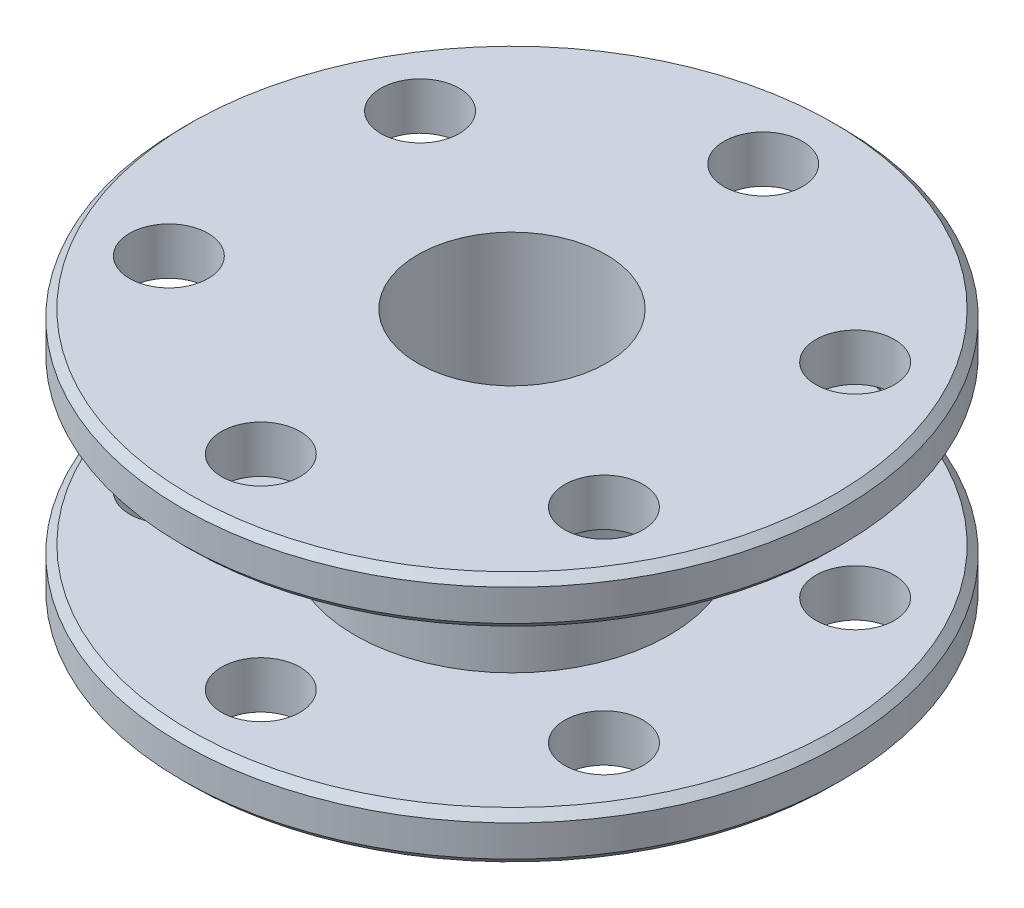
ISO-10303-21;
HEADER;
FILE_DESCRIPTION(('STEP AP214'),'2;1');
FILE_NAME('part.step','',(''),(''),'','','');
FILE_SCHEMA(('AUTOMOTIVE_DESIGN { 1 0 10303 214 1 1 1 1 }'));
ENDSEC;
DATA;
#1=APPLICATION_CONTEXT('core data for automotive mechanical design processes');
#2=APPLICATION_PROTOCOL_DEFINITION('international standard','automotive_design',2000,#1);
#3=PRODUCT_CONTEXT('',#1,'mechanical');
#4=PRODUCT('Part','Part','',(#3));
#5=PRODUCT_RELATED_PRODUCT_CATEGORY('part','',(#4));
#6=PRODUCT_DEFINITION_FORMATION('','',#4);
#7=PRODUCT_DEFINITION_CONTEXT('part definition',#1,'design');
#8=PRODUCT_DEFINITION('design','',#6,#7);
#9=PRODUCT_DEFINITION_SHAPE('','',#8);
#10=(LENGTH_UNIT() NAMED_UNIT(*) SI_UNIT(.MILLI.,.METRE.));
#11=(NAMED_UNIT(*) PLANE_ANGLE_UNIT() SI_UNIT($,.RADIAN.));
#12=(NAMED_UNIT(*) SI_UNIT($,.STERADIAN.) SOLID_ANGLE_UNIT());
#13=UNCERTAINTY_MEASURE_WITH_UNIT(LENGTH_MEASURE(1.E-05),#10,'distance_accuracy_value','');
#14=(GEOMETRIC_REPRESENTATION_CONTEXT(3) GLOBAL_UNCERTAINTY_ASSIGNED_CONTEXT((#13)) GLOBAL_UNIT_ASSIGNED_CONTEXT((#10,
#11,#12)) REPRESENTATION_CONTEXT('',''));
#15=CARTESIAN_POINT('',(0.,0.,0.));
#16=DIRECTION('',(0.,0.,1.));
#17=DIRECTION('',(1.,0.,0.));
#18=AXIS2_PLACEMENT_3D('',#15,#16,#17);
#19=CARTESIAN_POINT('',(0.,16.,0.));
#20=DIRECTION('',(0.,-1.,0.));
#21=DIRECTION('',(0.,0.,-1.));
#22=AXIS2_PLACEMENT_3D('',#19,#20,#21);
#23=CYLINDRICAL_SURFACE('',#22,21.);
#24=CARTESIAN_POINT('',(0.,0.499999999999994,0.));
#25=DIRECTION('',(0.,1.,0.));
#26=DIRECTION('',(0.,0.,1.));
#27=AXIS2_PLACEMENT_3D('',#24,#25,#26);
#28=CIRCLE('',#27,21.);
#29=CARTESIAN_POINT('',(0.,0.499999999999994,21.));
#30=VERTEX_POINT('',#29);
#31=EDGE_CURVE('E63',#30,#30,#28,.T.);
#32=ORIENTED_EDGE('',*,*,#31,.T.);
#33=EDGE_LOOP('',(#32));
#34=FACE_BOUND('',#33,.T.);
#35=CARTESIAN_POINT('',(0.,2.49999999999999,0.));
#36=DIRECTION('',(0.,-1.,0.));
#37=DIRECTION('',(0.,0.,-1.));
#38=AXIS2_PLACEMENT_3D('',#35,#36,#37);
#39=CIRCLE('',#38,21.);
#40=CARTESIAN_POINT('',(0.,2.49999999999999,-21.));
#41=VERTEX_POINT('',#40);
#42=EDGE_CURVE('E66',#41,#41,#39,.T.);
#43=ORIENTED_EDGE('',*,*,#42,.T.);
#44=EDGE_LOOP('',(#43));
#45=FACE_BOUND('',#44,.T.);
#46=ADVANCED_FACE('F36',(#34,#45),#23,.T.);
#47=CARTESIAN_POINT('',(0.,16.,-16.));
#48=DIRECTION('',(0.,-1.,0.));
#49=DIRECTION('',(0.,0.,-1.));
#50=AXIS2_PLACEMENT_3D('',#47,#48,#49);
#51=CYLINDRICAL_SURFACE('',#50,2.5);
#52=CARTESIAN_POINT('',(0.,3.,-16.));
#53=DIRECTION('',(0.,-1.,0.));
#54=DIRECTION('',(0.,0.,-1.));
#55=AXIS2_PLACEMENT_3D('',#52,#53,#54);
#56=CIRCLE('',#55,2.5);
#57=CARTESIAN_POINT('',(0.,3.,-18.5));
#58=VERTEX_POINT('',#57);
#59=EDGE_CURVE('E119',#58,#58,#56,.T.);
#60=ORIENTED_EDGE('',*,*,#59,.F.);
#61=EDGE_LOOP('',(#60));
#62=FACE_BOUND('',#61,.T.);
#63=CARTESIAN_POINT('',(0.,0.,-16.));
#64=DIRECTION('',(0.,1.,0.));
#65=DIRECTION('',(0.,0.,1.));
#66=AXIS2_PLACEMENT_3D('',#63,#64,#65);
#67=CIRCLE('',#66,2.5);
#68=CARTESIAN_POINT('',(0.,0.,-13.5));
#69=VERTEX_POINT('',#68);
#70=EDGE_CURVE('E86',#69,#69,#67,.T.);
#71=ORIENTED_EDGE('',*,*,#70,.F.);
#72=EDGE_LOOP('',(#71));
#73=FACE_BOUND('',#72,.T.);
#74=ADVANCED_FACE('F179',(#62,#73),#51,.F.);
#75=CARTESIAN_POINT('',(13.8564064605512,16.,-8.0000000000004));
#76=DIRECTION('',(0.,-1.,0.));
#77=DIRECTION('',(0.,0.,-1.));
#78=AXIS2_PLACEMENT_3D('',#75,#76,#77);
#79=CYLINDRICAL_SURFACE('',#78,2.50000000000014);
#80=CARTESIAN_POINT('',(13.8564064605512,3.,-8.0000000000004));
#81=DIRECTION('',(0.,-1.,0.));
#82=DIRECTION('',(0.,0.,-1.));
#83=AXIS2_PLACEMENT_3D('',#80,#81,#82);
#84=CIRCLE('',#83,2.50000000000014);
#85=CARTESIAN_POINT('',(13.8564064605512,3.,-10.5000000000005));
#86=VERTEX_POINT('',#85);
#87=EDGE_CURVE('E124',#86,#86,#84,.T.);
#88=ORIENTED_EDGE('',*,*,#87,.F.);
#89=EDGE_LOOP('',(#88));
#90=FACE_BOUND('',#89,.T.);
#91=CARTESIAN_POINT('',(13.8564064605512,0.,-8.0000000000004));
#92=DIRECTION('',(0.,1.,0.));
#93=DIRECTION('',(0.,0.,1.));
#94=AXIS2_PLACEMENT_3D('',#91,#92,#93);
#95=CIRCLE('',#94,2.50000000000014);
#96=CARTESIAN_POINT('',(13.8564064605512,0.,-5.50000000000025));
#97=VERTEX_POINT('',#96);
#98=EDGE_CURVE('E92',#97,#97,#95,.T.);
#99=ORIENTED_EDGE('',*,*,#98,.F.);
#100=EDGE_LOOP('',(#99));
#101=FACE_BOUND('',#100,.T.);
#102=ADVANCED_FACE('F221',(#90,#101),#79,.F.);
#103=CARTESIAN_POINT('',(13.8564064605517,16.,7.99999999999961));
#104=DIRECTION('',(0.,-1.,0.));
#105=DIRECTION('',(0.,0.,-1.));
#106=AXIS2_PLACEMENT_3D('',#103,#104,#105);
#107=CYLINDRICAL_SURFACE('',#106,2.50000000000061);
#108=CARTESIAN_POINT('',(13.8564064605517,3.,7.99999999999961));
#109=DIRECTION('',(0.,-1.,0.));
#110=DIRECTION('',(0.,0.,-1.));
#111=AXIS2_PLACEMENT_3D('',#108,#109,#110);
#112=CIRCLE('',#111,2.50000000000061);
#113=CARTESIAN_POINT('',(13.8564064605517,3.,5.499999999999));
#114=VERTEX_POINT('',#113);
#115=EDGE_CURVE('E127',#114,#114,#112,.T.);
#116=ORIENTED_EDGE('',*,*,#115,.F.);
#117=EDGE_LOOP('',(#116));
#118=FACE_BOUND('',#117,.T.);
#119=CARTESIAN_POINT('',(13.8564064605517,0.,7.99999999999961));
#120=DIRECTION('',(0.,1.,0.));
#121=DIRECTION('',(0.,0.,1.));
#122=AXIS2_PLACEMENT_3D('',#119,#120,#121);
#123=CIRCLE('',#122,2.50000000000061);
#124=CARTESIAN_POINT('',(13.8564064605517,0.,10.5000000000002));
#125=VERTEX_POINT('',#124);
#126=EDGE_CURVE('E98',#125,#125,#123,.T.);
#127=ORIENTED_EDGE('',*,*,#126,.F.);
#128=EDGE_LOOP('',(#127));
#129=FACE_BOUND('',#128,.T.);
#130=ADVANCED_FACE('F294',(#118,#129),#107,.F.);
#131=CARTESIAN_POINT('',(9.03616397137021E-13,16.,16.));
#132=DIRECTION('',(0.,-1.,0.));
#133=DIRECTION('',(0.,0.,-1.));
#134=AXIS2_PLACEMENT_3D('',#131,#132,#133);
#135=CYLINDRICAL_SURFACE('',#134,2.50000000000097);
#136=CARTESIAN_POINT('',(9.03616397137021E-13,3.,16.));
#137=DIRECTION('',(0.,-1.,0.));
#138=DIRECTION('',(0.,0.,-1.));
#139=AXIS2_PLACEMENT_3D('',#136,#137,#138);
#140=CIRCLE('',#139,2.50000000000097);
#141=CARTESIAN_POINT('',(9.03616397137021E-13,3.,13.499999999999));
#142=VERTEX_POINT('',#141);
#143=EDGE_CURVE('E130',#142,#142,#140,.T.);
#144=ORIENTED_EDGE('',*,*,#143,.F.);
#145=EDGE_LOOP('',(#144));
#146=FACE_BOUND('',#145,.T.);
#147=CARTESIAN_POINT('',(9.03616397137021E-13,0.,16.));
#148=DIRECTION('',(0.,1.,0.));
#149=DIRECTION('',(0.,0.,1.));
#150=AXIS2_PLACEMENT_3D('',#147,#148,#149);
#151=CIRCLE('',#150,2.50000000000097);
#152=CARTESIAN_POINT('',(9.03616397137021E-13,0.,18.500000000001));
#153=VERTEX_POINT('',#152);
#154=EDGE_CURVE('E104',#153,#153,#151,.T.);
#155=ORIENTED_EDGE('',*,*,#154,.F.);
#156=EDGE_LOOP('',(#155));
#157=FACE_BOUND('',#156,.T.);
#158=ADVANCED_FACE('F289',(#146,#157),#135,.F.);
#159=CARTESIAN_POINT('',(-13.8564064605503,16.,8.0000000000004));
#160=DIRECTION('',(0.,-1.,0.));
#161=DIRECTION('',(0.,0.,-1.));
#162=AXIS2_PLACEMENT_3D('',#159,#160,#161);
#163=CYLINDRICAL_SURFACE('',#162,2.50000000000091);
#164=CARTESIAN_POINT('',(-13.8564064605503,3.,8.0000000000004));
#165=DIRECTION('',(0.,-1.,0.));
#166=DIRECTION('',(0.,0.,-1.));
#167=AXIS2_PLACEMENT_3D('',#164,#165,#166);
#168=CIRCLE('',#167,2.50000000000091);
#169=CARTESIAN_POINT('',(-13.8564064605503,3.,5.49999999999949));
#170=VERTEX_POINT('',#169);
#171=EDGE_CURVE('E73',#170,#170,#168,.T.);
#172=ORIENTED_EDGE('',*,*,#171,.F.);
#173=EDGE_LOOP('',(#172));
#174=FACE_BOUND('',#173,.T.);
#175=CARTESIAN_POINT('',(-13.8564064605503,0.,8.0000000000004));
#176=DIRECTION('',(0.,1.,0.));
#177=DIRECTION('',(0.,0.,1.));
#178=AXIS2_PLACEMENT_3D('',#175,#176,#177);
#179=CIRCLE('',#178,2.50000000000091);
#180=CARTESIAN_POINT('',(-13.8564064605503,0.,10.5000000000013));
#181=VERTEX_POINT('',#180);
#182=EDGE_CURVE('E110',#181,#181,#179,.T.);
#183=ORIENTED_EDGE('',*,*,#182,.F.);
#184=EDGE_LOOP('',(#183));
#185=FACE_BOUND('',#184,.T.);
#186=ADVANCED_FACE('F210',(#174,#185),#163,.F.);
#187=CARTESIAN_POINT('',(-13.8564064605508,16.,-7.9999999999996));
#188=DIRECTION('',(0.,-1.,0.));
#189=DIRECTION('',(0.,0.,-1.));
#190=AXIS2_PLACEMENT_3D('',#187,#188,#189);
#191=CYLINDRICAL_SURFACE('',#190,2.50000000000052);
#192=CARTESIAN_POINT('',(-13.8564064605508,3.,-7.9999999999996));
#193=DIRECTION('',(0.,-1.,0.));
#194=DIRECTION('',(0.,0.,-1.));
#195=AXIS2_PLACEMENT_3D('',#192,#193,#194);
#196=CIRCLE('',#195,2.50000000000052);
#197=CARTESIAN_POINT('',(-13.8564064605508,3.,-10.5000000000001));
#198=VERTEX_POINT('',#197);
#199=EDGE_CURVE('E70',#198,#198,#196,.T.);
#200=ORIENTED_EDGE('',*,*,#199,.F.);
#201=EDGE_LOOP('',(#200));
#202=FACE_BOUND('',#201,.T.);
#203=CARTESIAN_POINT('',(-13.8564064605508,0.,-7.9999999999996));
#204=DIRECTION('',(0.,1.,0.));
#205=DIRECTION('',(0.,0.,1.));
#206=AXIS2_PLACEMENT_3D('',#203,#204,#205);
#207=CIRCLE('',#206,2.50000000000052);
#208=CARTESIAN_POINT('',(-13.8564064605508,0.,-5.49999999999908));
#209=VERTEX_POINT('',#208);
#210=EDGE_CURVE('E116',#209,#209,#207,.T.);
#211=ORIENTED_EDGE('',*,*,#210,.F.);
#212=EDGE_LOOP('',(#211));
#213=FACE_BOUND('',#212,.T.);
#214=ADVANCED_FACE('F186',(#202,#213),#191,.F.);
#215=CARTESIAN_POINT('',(0.,16.,0.));
#216=DIRECTION('',(0.,1.,0.));
#217=DIRECTION('',(0.,0.,1.));
#218=AXIS2_PLACEMENT_3D('',#215,#216,#217);
#219=PLANE('',#218);
#220=CARTESIAN_POINT('',(0.,16.,0.));
#221=DIRECTION('',(0.,1.,0.));
#222=DIRECTION('',(0.,0.,1.));
#223=AXIS2_PLACEMENT_3D('',#220,#221,#222);
#224=CIRCLE('',#223,20.5);
#225=CARTESIAN_POINT('',(0.,16.,20.5));
#226=VERTEX_POINT('',#225);
#227=EDGE_CURVE('E10',#226,#226,#224,.T.);
#228=ORIENTED_EDGE('',*,*,#227,.T.);
#229=EDGE_LOOP('',(#228));
#230=FACE_BOUND('',#229,.T.);
#231=CARTESIAN_POINT('',(-13.8564064605503,16.,8.0000000000004));
#232=DIRECTION('',(0.,1.,0.));
#233=DIRECTION('',(0.,0.,1.));
#234=AXIS2_PLACEMENT_3D('',#231,#232,#233);
#235=CIRCLE('',#234,2.50000000000091);
#236=CARTESIAN_POINT('',(-13.8564064605503,16.,10.5000000000013));
#237=VERTEX_POINT('',#236);
#238=EDGE_CURVE('E107',#237,#237,#235,.T.);
#239=ORIENTED_EDGE('',*,*,#238,.F.);
#240=EDGE_LOOP('',(#239));
#241=FACE_BOUND('',#240,.T.);
#242=CARTESIAN_POINT('',(13.8564064605517,16.,7.99999999999961));
#243=DIRECTION('',(0.,1.,0.));
#244=DIRECTION('',(0.,0.,1.));
#245=AXIS2_PLACEMENT_3D('',#242,#243,#244);
#246=CIRCLE('',#245,2.50000000000061);
#247=CARTESIAN_POINT('',(13.8564064605517,16.,10.5000000000002));
#248=VERTEX_POINT('',#247);
#249=EDGE_CURVE('E95',#248,#248,#246,.T.);
#250=ORIENTED_EDGE('',*,*,#249,.F.);
#251=EDGE_LOOP('',(#250));
#252=FACE_BOUND('',#251,.T.);
#253=CARTESIAN_POINT('',(0.,16.,-16.));
#254=DIRECTION('',(0.,1.,0.));
#255=DIRECTION('',(0.,0.,1.));
#256=AXIS2_PLACEMENT_3D('',#253,#254,#255);
#257=CIRCLE('',#256,2.5);
#258=CARTESIAN_POINT('',(0.,16.,-13.5));
#259=VERTEX_POINT('',#258);
#260=EDGE_CURVE('E83',#259,#259,#257,.T.);
#261=ORIENTED_EDGE('',*,*,#260,.F.);
#262=EDGE_LOOP('',(#261));
#263=FACE_BOUND('',#262,.T.);
#264=CARTESIAN_POINT('',(0.,16.,0.));
#265=DIRECTION('',(0.,1.,0.));
#266=DIRECTION('',(0.,0.,1.));
#267=AXIS2_PLACEMENT_3D('',#264,#265,#266);
#268=CIRCLE('',#267,6.);
#269=CARTESIAN_POINT('',(0.,16.,6.));
#270=VERTEX_POINT('',#269);
#271=EDGE_CURVE('E69',#270,#270,#268,.T.);
#272=ORIENTED_EDGE('',*,*,#271,.F.);
#273=EDGE_LOOP('',(#272));
#274=FACE_BOUND('',#273,.T.);
#275=CARTESIAN_POINT('',(13.8564064605512,16.,-8.0000000000004));
#276=DIRECTION('',(0.,1.,0.));
#277=DIRECTION('',(0.,0.,1.));
#278=AXIS2_PLACEMENT_3D('',#275,#276,#277);
#279=CIRCLE('',#278,2.50000000000014);
#280=CARTESIAN_POINT('',(13.8564064605512,16.,-5.50000000000025));
#281=VERTEX_POINT('',#280);
#282=EDGE_CURVE('E89',#281,#281,#279,.T.);
#283=ORIENTED_EDGE('',*,*,#282,.F.);
#284=EDGE_LOOP('',(#283));
#285=FACE_BOUND('',#284,.T.);
#286=CARTESIAN_POINT('',(9.03616397137021E-13,16.,16.));
#287=DIRECTION('',(0.,1.,0.));
#288=DIRECTION('',(0.,0.,1.));
#289=AXIS2_PLACEMENT_3D('',#286,#287,#288);
#290=CIRCLE('',#289,2.50000000000097);
#291=CARTESIAN_POINT('',(9.03616397137021E-13,16.,18.500000000001));
#292=VERTEX_POINT('',#291);
#293=EDGE_CURVE('E101',#292,#292,#290,.T.);
#294=ORIENTED_EDGE('',*,*,#293,.F.);
#295=EDGE_LOOP('',(#294));
#296=FACE_BOUND('',#295,.T.);
#297=CARTESIAN_POINT('',(-13.8564064605508,16.,-7.9999999999996));
#298=DIRECTION('',(0.,1.,0.));
#299=DIRECTION('',(0.,0.,1.));
#300=AXIS2_PLACEMENT_3D('',#297,#298,#299);
#301=CIRCLE('',#300,2.50000000000052);
#302=CARTESIAN_POINT('',(-13.8564064605508,16.,-5.49999999999908));
#303=VERTEX_POINT('',#302);
#304=EDGE_CURVE('E113',#303,#303,#301,.T.);
#305=ORIENTED_EDGE('',*,*,#304,.F.);
#306=EDGE_LOOP('',(#305));
#307=FACE_BOUND('',#306,.T.);
#308=ADVANCED_FACE('F182',(#230,#241,#252,#263,#274,#285,#296,#307),#219,.T.);
#309=CARTESIAN_POINT('',(0.,0.,0.));
#310=DIRECTION('',(0.,1.,0.));
#311=DIRECTION('',(0.,0.,1.));
#312=AXIS2_PLACEMENT_3D('',#309,#310,#311);
#313=PLANE('',#312);
#314=CARTESIAN_POINT('',(0.,0.,0.));
#315=DIRECTION('',(0.,1.,0.));
#316=DIRECTION('',(0.,0.,1.));
#317=AXIS2_PLACEMENT_3D('',#314,#315,#316);
#318=CIRCLE('',#317,20.5);
#319=CARTESIAN_POINT('',(0.,0.,20.5));
#320=VERTEX_POINT('',#319);
#321=EDGE_CURVE('E60',#320,#320,#318,.F.);
#322=ORIENTED_EDGE('',*,*,#321,.T.);
#323=EDGE_LOOP('',(#322));
#324=FACE_BOUND('',#323,.T.);
#325=CARTESIAN_POINT('',(0.,0.,0.));
#326=DIRECTION('',(0.,1.,0.));
#327=DIRECTION('',(0.,0.,1.));
#328=AXIS2_PLACEMENT_3D('',#325,#326,#327);
#329=CIRCLE('',#328,6.);
#330=CARTESIAN_POINT('',(0.,0.,6.));
#331=VERTEX_POINT('',#330);
#332=EDGE_CURVE('E80',#331,#331,#329,.T.);
#333=ORIENTED_EDGE('',*,*,#332,.T.);
#334=EDGE_LOOP('',(#333));
#335=FACE_BOUND('',#334,.T.);
#336=ORIENTED_EDGE('',*,*,#70,.T.);
#337=EDGE_LOOP('',(#336));
#338=FACE_BOUND('',#337,.T.);
#339=ORIENTED_EDGE('',*,*,#98,.T.);
#340=EDGE_LOOP('',(#339));
#341=FACE_BOUND('',#340,.T.);
#342=ORIENTED_EDGE('',*,*,#126,.T.);
#343=EDGE_LOOP('',(#342));
#344=FACE_BOUND('',#343,.T.);
#345=ORIENTED_EDGE('',*,*,#154,.T.);
#346=EDGE_LOOP('',(#345));
#347=FACE_BOUND('',#346,.T.);
#348=ORIENTED_EDGE('',*,*,#182,.T.);
#349=EDGE_LOOP('',(#348));
#350=FACE_BOUND('',#349,.T.);
#351=ORIENTED_EDGE('',*,*,#210,.T.);
#352=EDGE_LOOP('',(#351));
#353=FACE_BOUND('',#352,.T.);
#354=ADVANCED_FACE('F185',(#324,#335,#338,#341,#344,#347,#350,#353),#313,.F.);
#355=CARTESIAN_POINT('',(0.,13.5,0.));
#356=DIRECTION('',(0.,1.,0.));
#357=DIRECTION('',(0.,0.,1.));
#358=AXIS2_PLACEMENT_3D('',#355,#356,#357);
#359=CIRCLE('',#358,21.);
#360=CARTESIAN_POINT('',(0.,13.5,21.));
#361=VERTEX_POINT('',#360);
#362=EDGE_CURVE('E48',#361,#361,#359,.T.);
#363=ORIENTED_EDGE('',*,*,#362,.T.);
#364=EDGE_LOOP('',(#363));
#365=FACE_BOUND('',#364,.T.);
#366=CARTESIAN_POINT('',(0.,15.5,0.));
#367=DIRECTION('',(0.,1.,0.));
#368=DIRECTION('',(0.,0.,1.));
#369=AXIS2_PLACEMENT_3D('',#366,#367,#368);
#370=CIRCLE('',#369,21.);
#371=CARTESIAN_POINT('',(0.,15.5,21.));
#372=VERTEX_POINT('',#371);
#373=EDGE_CURVE('E52',#372,#372,#370,.F.);
#374=ORIENTED_EDGE('',*,*,#373,.T.);
#375=EDGE_LOOP('',(#374));
#376=FACE_BOUND('',#375,.T.);
#377=ADVANCED_FACE('F217',(#365,#376),#23,.T.);
#378=CARTESIAN_POINT('',(0.,16.,0.));
#379=DIRECTION('',(0.,-1.,0.));
#380=DIRECTION('',(0.,0.,-1.));
#381=AXIS2_PLACEMENT_3D('',#378,#379,#380);
#382=CYLINDRICAL_SURFACE('',#381,6.);
#383=ORIENTED_EDGE('',*,*,#271,.T.);
#384=EDGE_LOOP('',(#383));
#385=FACE_BOUND('',#384,.T.);
#386=ORIENTED_EDGE('',*,*,#332,.F.);
#387=EDGE_LOOP('',(#386));
#388=FACE_BOUND('',#387,.T.);
#389=ADVANCED_FACE('F177',(#385,#388),#382,.F.);
#390=CARTESIAN_POINT('',(0.,13.,-16.));
#391=DIRECTION('',(0.,1.,0.));
#392=DIRECTION('',(0.,0.,1.));
#393=AXIS2_PLACEMENT_3D('',#390,#391,#392);
#394=CIRCLE('',#393,2.5);
#395=CARTESIAN_POINT('',(0.,13.,-13.5));
#396=VERTEX_POINT('',#395);
#397=EDGE_CURVE('E74',#396,#396,#394,.T.);
#398=ORIENTED_EDGE('',*,*,#397,.F.);
#399=EDGE_LOOP('',(#398));
#400=FACE_BOUND('',#399,.T.);
#401=ORIENTED_EDGE('',*,*,#260,.T.);
#402=EDGE_LOOP('',(#401));
#403=FACE_BOUND('',#402,.T.);
#404=ADVANCED_FACE('F173',(#400,#403),#51,.F.);
#405=CARTESIAN_POINT('',(13.8564064605512,13.,-8.0000000000004));
#406=DIRECTION('',(0.,1.,0.));
#407=DIRECTION('',(0.,0.,1.));
#408=AXIS2_PLACEMENT_3D('',#405,#406,#407);
#409=CIRCLE('',#408,2.50000000000014);
#410=CARTESIAN_POINT('',(13.8564064605512,13.,-5.50000000000025));
#411=VERTEX_POINT('',#410);
#412=EDGE_CURVE('E137',#411,#411,#409,.T.);
#413=ORIENTED_EDGE('',*,*,#412,.F.);
#414=EDGE_LOOP('',(#413));
#415=FACE_BOUND('',#414,.T.);
#416=ORIENTED_EDGE('',*,*,#282,.T.);
#417=EDGE_LOOP('',(#416));
#418=FACE_BOUND('',#417,.T.);
#419=ADVANCED_FACE('F176',(#415,#418),#79,.F.);
#420=CARTESIAN_POINT('',(13.8564064605517,13.,7.99999999999961));
#421=DIRECTION('',(0.,1.,0.));
#422=DIRECTION('',(0.,0.,1.));
#423=AXIS2_PLACEMENT_3D('',#420,#421,#422);
#424=CIRCLE('',#423,2.50000000000061);
#425=CARTESIAN_POINT('',(13.8564064605517,13.,10.5000000000002));
#426=VERTEX_POINT('',#425);
#427=EDGE_CURVE('E140',#426,#426,#424,.T.);
#428=ORIENTED_EDGE('',*,*,#427,.F.);
#429=EDGE_LOOP('',(#428));
#430=FACE_BOUND('',#429,.T.);
#431=ORIENTED_EDGE('',*,*,#249,.T.);
#432=EDGE_LOOP('',(#431));
#433=FACE_BOUND('',#432,.T.);
#434=ADVANCED_FACE('F300',(#430,#433),#107,.F.);
#435=CARTESIAN_POINT('',(9.03616397137021E-13,13.,16.));
#436=DIRECTION('',(0.,1.,0.));
#437=DIRECTION('',(0.,0.,1.));
#438=AXIS2_PLACEMENT_3D('',#435,#436,#437);
#439=CIRCLE('',#438,2.50000000000097);
#440=CARTESIAN_POINT('',(9.03616397137021E-13,13.,18.500000000001));
#441=VERTEX_POINT('',#440);
#442=EDGE_CURVE('E143',#441,#441,#439,.T.);
#443=ORIENTED_EDGE('',*,*,#442,.F.);
#444=EDGE_LOOP('',(#443));
#445=FACE_BOUND('',#444,.T.);
#446=ORIENTED_EDGE('',*,*,#293,.T.);
#447=EDGE_LOOP('',(#446));
#448=FACE_BOUND('',#447,.T.);
#449=ADVANCED_FACE('F207',(#445,#448),#135,.F.);
#450=CARTESIAN_POINT('',(-13.8564064605503,13.,8.0000000000004));
#451=DIRECTION('',(0.,1.,0.));
#452=DIRECTION('',(0.,0.,1.));
#453=AXIS2_PLACEMENT_3D('',#450,#451,#452);
#454=CIRCLE('',#453,2.50000000000091);
#455=CARTESIAN_POINT('',(-13.8564064605503,13.,10.5000000000013));
#456=VERTEX_POINT('',#455);
#457=EDGE_CURVE('E78',#456,#456,#454,.T.);
#458=ORIENTED_EDGE('',*,*,#457,.F.);
#459=EDGE_LOOP('',(#458));
#460=FACE_BOUND('',#459,.T.);
#461=ORIENTED_EDGE('',*,*,#238,.T.);
#462=EDGE_LOOP('',(#461));
#463=FACE_BOUND('',#462,.T.);
#464=ADVANCED_FACE('F198',(#460,#463),#163,.F.);
#465=CARTESIAN_POINT('',(-13.8564064605508,13.,-7.9999999999996));
#466=DIRECTION('',(0.,1.,0.));
#467=DIRECTION('',(0.,0.,1.));
#468=AXIS2_PLACEMENT_3D('',#465,#466,#467);
#469=CIRCLE('',#468,2.50000000000052);
#470=CARTESIAN_POINT('',(-13.8564064605508,13.,-5.49999999999908));
#471=VERTEX_POINT('',#470);
#472=EDGE_CURVE('E75',#471,#471,#469,.T.);
#473=ORIENTED_EDGE('',*,*,#472,.F.);
#474=EDGE_LOOP('',(#473));
#475=FACE_BOUND('',#474,.T.);
#476=ORIENTED_EDGE('',*,*,#304,.T.);
#477=EDGE_LOOP('',(#476));
#478=FACE_BOUND('',#477,.T.);
#479=ADVANCED_FACE('F196',(#475,#478),#191,.F.);
#480=CARTESIAN_POINT('',(0.,3.,-10.));
#481=DIRECTION('',(0.,-1.,0.));
#482=DIRECTION('',(0.,0.,-1.));
#483=AXIS2_PLACEMENT_3D('',#480,#481,#482);
#484=PLANE('',#483);
#485=CARTESIAN_POINT('',(0.,3.,0.));
#486=DIRECTION('',(0.,-1.,0.));
#487=DIRECTION('',(0.,0.,-1.));
#488=AXIS2_PLACEMENT_3D('',#485,#486,#487);
#489=CIRCLE('',#488,20.5);
#490=CARTESIAN_POINT('',(0.,3.,-20.5));
#491=VERTEX_POINT('',#490);
#492=EDGE_CURVE('E57',#491,#491,#489,.F.);
#493=ORIENTED_EDGE('',*,*,#492,.T.);
#494=EDGE_LOOP('',(#493));
#495=FACE_BOUND('',#494,.T.);
#496=CARTESIAN_POINT('',(0.,3.,0.));
#497=DIRECTION('',(0.,-1.,0.));
#498=DIRECTION('',(0.,0.,-1.));
#499=AXIS2_PLACEMENT_3D('',#496,#497,#498);
#500=CIRCLE('',#499,10.);
#501=CARTESIAN_POINT('',(0.,3.,-10.));
#502=VERTEX_POINT('',#501);
#503=EDGE_CURVE('E79',#502,#502,#500,.T.);
#504=ORIENTED_EDGE('',*,*,#503,.T.);
#505=EDGE_LOOP('',(#504));
#506=FACE_BOUND('',#505,.T.);
#507=ORIENTED_EDGE('',*,*,#199,.T.);
#508=EDGE_LOOP('',(#507));
#509=FACE_BOUND('',#508,.T.);
#510=ORIENTED_EDGE('',*,*,#171,.T.);
#511=EDGE_LOOP('',(#510));
#512=FACE_BOUND('',#511,.T.);
#513=ORIENTED_EDGE('',*,*,#143,.T.);
#514=EDGE_LOOP('',(#513));
#515=FACE_BOUND('',#514,.T.);
#516=ORIENTED_EDGE('',*,*,#115,.T.);
#517=EDGE_LOOP('',(#516));
#518=FACE_BOUND('',#517,.T.);
#519=ORIENTED_EDGE('',*,*,#87,.T.);
#520=EDGE_LOOP('',(#519));
#521=FACE_BOUND('',#520,.T.);
#522=ORIENTED_EDGE('',*,*,#59,.T.);
#523=EDGE_LOOP('',(#522));
#524=FACE_BOUND('',#523,.T.);
#525=ADVANCED_FACE('F159',(#495,#506,#509,#512,#515,#518,#521,#524),#484,.F.);
#526=CARTESIAN_POINT('',(0.,13.,-10.));
#527=DIRECTION('',(0.,1.,0.));
#528=DIRECTION('',(0.,0.,1.));
#529=AXIS2_PLACEMENT_3D('',#526,#527,#528);
#530=PLANE('',#529);
#531=CARTESIAN_POINT('',(0.,13.,0.));
#532=DIRECTION('',(0.,1.,0.));
#533=DIRECTION('',(0.,0.,1.));
#534=AXIS2_PLACEMENT_3D('',#531,#532,#533);
#535=CIRCLE('',#534,20.5);
#536=CARTESIAN_POINT('',(0.,13.,20.5));
#537=VERTEX_POINT('',#536);
#538=EDGE_CURVE('E44',#537,#537,#535,.F.);
#539=ORIENTED_EDGE('',*,*,#538,.T.);
#540=EDGE_LOOP('',(#539));
#541=FACE_BOUND('',#540,.T.);
#542=CARTESIAN_POINT('',(0.,13.,0.));
#543=DIRECTION('',(0.,-1.,0.));
#544=DIRECTION('',(0.,0.,-1.));
#545=AXIS2_PLACEMENT_3D('',#542,#543,#544);
#546=CIRCLE('',#545,10.);
#547=CARTESIAN_POINT('',(0.,13.,-10.));
#548=VERTEX_POINT('',#547);
#549=EDGE_CURVE('E150',#548,#548,#546,.T.);
#550=ORIENTED_EDGE('',*,*,#549,.F.);
#551=EDGE_LOOP('',(#550));
#552=FACE_BOUND('',#551,.T.);
#553=ORIENTED_EDGE('',*,*,#472,.T.);
#554=EDGE_LOOP('',(#553));
#555=FACE_BOUND('',#554,.T.);
#556=ORIENTED_EDGE('',*,*,#457,.T.);
#557=EDGE_LOOP('',(#556));
#558=FACE_BOUND('',#557,.T.);
#559=ORIENTED_EDGE('',*,*,#442,.T.);
#560=EDGE_LOOP('',(#559));
#561=FACE_BOUND('',#560,.T.);
#562=ORIENTED_EDGE('',*,*,#427,.T.);
#563=EDGE_LOOP('',(#562));
#564=FACE_BOUND('',#563,.T.);
#565=ORIENTED_EDGE('',*,*,#412,.T.);
#566=EDGE_LOOP('',(#565));
#567=FACE_BOUND('',#566,.T.);
#568=ORIENTED_EDGE('',*,*,#397,.T.);
#569=EDGE_LOOP('',(#568));
#570=FACE_BOUND('',#569,.T.);
#571=ADVANCED_FACE('F156',(#541,#552,#555,#558,#561,#564,#567,#570),#530,.F.);
#572=CARTESIAN_POINT('',(0.,0.,0.));
#573=DIRECTION('',(0.,-1.,0.));
#574=DIRECTION('',(0.,0.,-1.));
#575=AXIS2_PLACEMENT_3D('',#572,#573,#574);
#576=CYLINDRICAL_SURFACE('',#575,10.);
#577=ORIENTED_EDGE('',*,*,#503,.F.);
#578=EDGE_LOOP('',(#577));
#579=FACE_BOUND('',#578,.T.);
#580=ORIENTED_EDGE('',*,*,#549,.T.);
#581=EDGE_LOOP('',(#580));
#582=FACE_BOUND('',#581,.T.);
#583=ADVANCED_FACE('F154',(#579,#582),#576,.T.);
#584=CARTESIAN_POINT('',(0.,0.499999999999994,0.));
#585=DIRECTION('',(0.,1.,0.));
#586=DIRECTION('',(0.,0.,1.));
#587=AXIS2_PLACEMENT_3D('',#584,#585,#586);
#588=CONICAL_SURFACE('',#587,21.,0.785398163397448);
#589=ORIENTED_EDGE('',*,*,#321,.F.);
#590=EDGE_LOOP('',(#589));
#591=FACE_BOUND('',#590,.T.);
#592=ORIENTED_EDGE('',*,*,#31,.F.);
#593=EDGE_LOOP('',(#592));
#594=FACE_BOUND('',#593,.T.);
#595=ADVANCED_FACE('F250',(#591,#594),#588,.T.);
#596=CARTESIAN_POINT('',(0.,2.49999999999999,0.));
#597=DIRECTION('',(0.,-1.,0.));
#598=DIRECTION('',(0.,0.,-1.));
#599=AXIS2_PLACEMENT_3D('',#596,#597,#598);
#600=CONICAL_SURFACE('',#599,21.,0.785398163397448);
#601=ORIENTED_EDGE('',*,*,#492,.F.);
#602=EDGE_LOOP('',(#601));
#603=FACE_BOUND('',#602,.T.);
#604=ORIENTED_EDGE('',*,*,#42,.F.);
#605=EDGE_LOOP('',(#604));
#606=FACE_BOUND('',#605,.T.);
#607=ADVANCED_FACE('F245',(#603,#606),#600,.T.);
#608=CARTESIAN_POINT('',(0.,13.5,0.));
#609=DIRECTION('',(0.,1.,0.));
#610=DIRECTION('',(0.,0.,1.));
#611=AXIS2_PLACEMENT_3D('',#608,#609,#610);
#612=CONICAL_SURFACE('',#611,21.,0.785398163397448);
#613=ORIENTED_EDGE('',*,*,#538,.F.);
#614=EDGE_LOOP('',(#613));
#615=FACE_BOUND('',#614,.T.);
#616=ORIENTED_EDGE('',*,*,#362,.F.);
#617=EDGE_LOOP('',(#616));
#618=FACE_BOUND('',#617,.T.);
#619=ADVANCED_FACE('F241',(#615,#618),#612,.T.);
#620=CARTESIAN_POINT('',(0.,16.,0.));
#621=DIRECTION('',(0.,-1.,0.));
#622=DIRECTION('',(0.,0.,-1.));
#623=AXIS2_PLACEMENT_3D('',#620,#621,#622);
#624=CONICAL_SURFACE('',#623,20.5,0.785398163397448);
#625=ORIENTED_EDGE('',*,*,#373,.F.);
#626=EDGE_LOOP('',(#625));
#627=FACE_BOUND('',#626,.T.);
#628=ORIENTED_EDGE('',*,*,#227,.F.);
#629=EDGE_LOOP('',(#628));
#630=FACE_BOUND('',#629,.T.);
#631=ADVANCED_FACE('F39',(#627,#630),#624,.T.);
#632=CLOSED_SHELL('',(#46,#74,#102,#130,#158,#186,#214,#308,#354,#377,#389,#404,#419,#434,#449,
#464,#479,#525,#571,#583,#595,#607,#619,#631));
#633=MANIFOLD_SOLID_BREP('B2',#632);
#634=ADVANCED_BREP_SHAPE_REPRESENTATION('',(#18,#633),#14);
#635=SHAPE_DEFINITION_REPRESENTATION(#9,#634);
ENDSEC;
END-ISO-10303-21;
